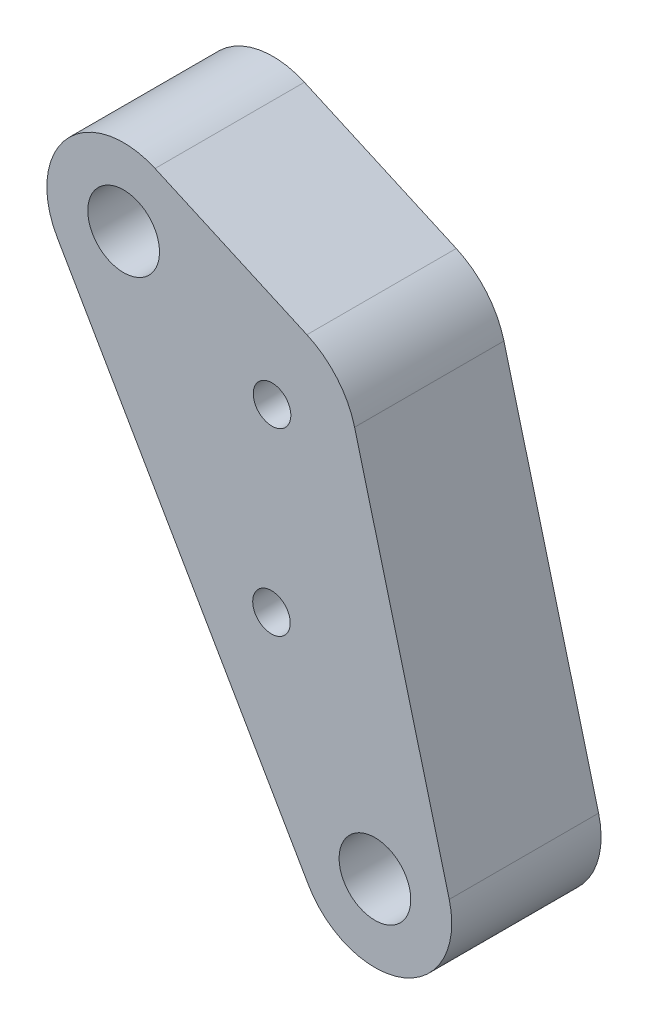
ISO-10303-21;
HEADER;
FILE_DESCRIPTION(('STEP AP214'),'2;1');
FILE_NAME('part.step','',(''),(''),'','','');
FILE_SCHEMA(('AUTOMOTIVE_DESIGN { 1 0 10303 214 1 1 1 1 }'));
ENDSEC;
DATA;
#1=APPLICATION_CONTEXT('core data for automotive mechanical design processes');
#2=APPLICATION_PROTOCOL_DEFINITION('international standard','automotive_design',2000,#1);
#3=PRODUCT_CONTEXT('',#1,'mechanical');
#4=PRODUCT('Part','Part','',(#3));
#5=PRODUCT_RELATED_PRODUCT_CATEGORY('part','',(#4));
#6=PRODUCT_DEFINITION_FORMATION('','',#4);
#7=PRODUCT_DEFINITION_CONTEXT('part definition',#1,'design');
#8=PRODUCT_DEFINITION('design','',#6,#7);
#9=PRODUCT_DEFINITION_SHAPE('','',#8);
#10=(LENGTH_UNIT() NAMED_UNIT(*) SI_UNIT(.MILLI.,.METRE.));
#11=(NAMED_UNIT(*) PLANE_ANGLE_UNIT() SI_UNIT($,.RADIAN.));
#12=(NAMED_UNIT(*) SI_UNIT($,.STERADIAN.) SOLID_ANGLE_UNIT());
#13=UNCERTAINTY_MEASURE_WITH_UNIT(LENGTH_MEASURE(1.E-05),#10,'distance_accuracy_value','');
#14=(GEOMETRIC_REPRESENTATION_CONTEXT(3) GLOBAL_UNCERTAINTY_ASSIGNED_CONTEXT((#13)) GLOBAL_UNIT_ASSIGNED_CONTEXT((#10,
#11,#12)) REPRESENTATION_CONTEXT('',''));
#15=CARTESIAN_POINT('',(0.,0.,0.));
#16=DIRECTION('',(0.,0.,1.));
#17=DIRECTION('',(1.,0.,0.));
#18=AXIS2_PLACEMENT_3D('',#15,#16,#17);
#19=CARTESIAN_POINT('',(0.,-34.,17.5));
#20=DIRECTION('',(0.,0.,1.));
#21=DIRECTION('',(1.,0.,0.));
#22=AXIS2_PLACEMENT_3D('',#19,#20,#21);
#23=PLANE('',#22);
#24=CARTESIAN_POINT('',(0.,-34.,17.5));
#25=DIRECTION('',(0.,0.,-1.));
#26=DIRECTION('',(-1.,0.,0.));
#27=AXIS2_PLACEMENT_3D('',#24,#25,#26);
#28=CIRCLE('',#27,4.20000000000001);
#29=CARTESIAN_POINT('',(-4.20000000000001,-34.,17.5));
#30=VERTEX_POINT('',#29);
#31=EDGE_CURVE('E338',#30,#30,#28,.T.);
#32=ORIENTED_EDGE('',*,*,#31,.T.);
#33=EDGE_LOOP('',(#32));
#34=FACE_BOUND('',#33,.T.);
#35=DIRECTION('',(-0.253215214139542,0.967409972725248,0.));
#36=VECTOR('',#35,1.);
#37=CARTESIAN_POINT('',(8.70668975452724,-31.7210630727441,17.5));
#38=LINE('',#37,#36);
#39=CARTESIAN_POINT('',(8.70668975452724,-31.7210630727441,17.5));
#40=VERTEX_POINT('',#39);
#41=CARTESIAN_POINT('',(-2.38326862762132,10.6481775451841,17.5));
#42=VERTEX_POINT('',#41);
#43=EDGE_CURVE('E154',#40,#42,#38,.T.);
#44=ORIENTED_EDGE('',*,*,#43,.T.);
#45=CARTESIAN_POINT('',(-12.0573683548738,8.11602540378865,17.5));
#46=DIRECTION('',(0.,0.,1.));
#47=DIRECTION('',(1.,0.,0.));
#48=AXIS2_PLACEMENT_3D('',#45,#46,#47);
#49=CIRCLE('',#48,10.);
#50=CARTESIAN_POINT('',(-7.96949925973064,17.2423240106157,17.5));
#51=VERTEX_POINT('',#50);
#52=EDGE_CURVE('E52',#42,#51,#49,.T.);
#53=ORIENTED_EDGE('',*,*,#52,.T.);
#54=DIRECTION('',(-0.912629860682705,0.408786909514317,0.));
#55=VECTOR('',#54,1.);
#56=CARTESIAN_POINT('',(-3.59656756097926,15.2835920956721,17.5));
#57=LINE('',#56,#55);
#58=CARTESIAN_POINT('',(-25.7657815430421,25.2136687461443,17.5));
#59=VERTEX_POINT('',#58);
#60=EDGE_CURVE('E156',#51,#59,#57,.T.);
#61=ORIENTED_EDGE('',*,*,#60,.T.);
#62=CARTESIAN_POINT('',(-29.4448637286709,17.,17.5));
#63=DIRECTION('',(0.,0.,1.));
#64=DIRECTION('',(1.,0.,0.));
#65=AXIS2_PLACEMENT_3D('',#62,#63,#64);
#66=CIRCLE('',#65,9.);
#67=CARTESIAN_POINT('',(-37.2390923627309,12.5,17.5));
#68=VERTEX_POINT('',#67);
#69=EDGE_CURVE('E158',#59,#68,#66,.T.);
#70=ORIENTED_EDGE('',*,*,#69,.T.);
#71=DIRECTION('',(0.500000000000001,-0.866025403784438,0.));
#72=VECTOR('',#71,1.);
#73=CARTESIAN_POINT('',(-37.2390923627309,12.5,17.5));
#74=LINE('',#73,#72);
#75=CARTESIAN_POINT('',(-7.79422863405994,-38.5,17.5));
#76=VERTEX_POINT('',#75);
#77=EDGE_CURVE('E140',#68,#76,#74,.T.);
#78=ORIENTED_EDGE('',*,*,#77,.T.);
#79=CARTESIAN_POINT('',(0.,-34.,17.5));
#80=DIRECTION('',(0.,0.,1.));
#81=DIRECTION('',(1.,0.,0.));
#82=AXIS2_PLACEMENT_3D('',#79,#80,#81);
#83=CIRCLE('',#82,9.);
#84=EDGE_CURVE('E134',#76,#40,#83,.T.);
#85=ORIENTED_EDGE('',*,*,#84,.T.);
#86=EDGE_LOOP('',(#44,#53,#61,#70,#78,#85));
#87=FACE_BOUND('',#86,.T.);
#88=CARTESIAN_POINT('',(-12.0573683548738,8.11602540378868,17.5));
#89=DIRECTION('',(0.,0.,-1.));
#90=DIRECTION('',(-1.,0.,0.));
#91=AXIS2_PLACEMENT_3D('',#88,#89,#90);
#92=CIRCLE('',#91,2.20000000000001);
#93=CARTESIAN_POINT('',(-14.2573683548738,8.11602540378868,17.5));
#94=VERTEX_POINT('',#93);
#95=EDGE_CURVE('E126',#94,#94,#92,.T.);
#96=ORIENTED_EDGE('',*,*,#95,.T.);
#97=EDGE_LOOP('',(#96));
#98=FACE_BOUND('',#97,.T.);
#99=CARTESIAN_POINT('',(-12.1243556529851,-12.999999999995,17.5));
#100=DIRECTION('',(0.,0.,-1.));
#101=DIRECTION('',(-1.,0.,0.));
#102=AXIS2_PLACEMENT_3D('',#99,#100,#101);
#103=CIRCLE('',#102,2.20000000000001);
#104=CARTESIAN_POINT('',(-14.3243556529851,-12.999999999995,17.5));
#105=VERTEX_POINT('',#104);
#106=EDGE_CURVE('E353',#105,#105,#103,.T.);
#107=ORIENTED_EDGE('',*,*,#106,.T.);
#108=EDGE_LOOP('',(#107));
#109=FACE_BOUND('',#108,.T.);
#110=CARTESIAN_POINT('',(-29.4448637286709,17.,17.5));
#111=DIRECTION('',(0.,0.,-1.));
#112=DIRECTION('',(-1.,0.,0.));
#113=AXIS2_PLACEMENT_3D('',#110,#111,#112);
#114=CIRCLE('',#113,4.20000000000001);
#115=CARTESIAN_POINT('',(-33.644863728671,17.,17.5));
#116=VERTEX_POINT('',#115);
#117=EDGE_CURVE('E342',#116,#116,#114,.T.);
#118=ORIENTED_EDGE('',*,*,#117,.T.);
#119=EDGE_LOOP('',(#118));
#120=FACE_BOUND('',#119,.T.);
#121=ADVANCED_FACE('F30',(#34,#87,#98,#109,#120),#23,.T.);
#122=CARTESIAN_POINT('',(0.,-34.,0.));
#123=DIRECTION('',(0.,0.,1.));
#124=DIRECTION('',(1.,0.,0.));
#125=AXIS2_PLACEMENT_3D('',#122,#123,#124);
#126=PLANE('',#125);
#127=CARTESIAN_POINT('',(0.,-34.,0.));
#128=DIRECTION('',(0.,0.,-1.));
#129=DIRECTION('',(-1.,0.,0.));
#130=AXIS2_PLACEMENT_3D('',#127,#128,#129);
#131=CIRCLE('',#130,4.20000000000001);
#132=CARTESIAN_POINT('',(-4.20000000000001,-34.,0.));
#133=VERTEX_POINT('',#132);
#134=EDGE_CURVE('E341',#133,#133,#131,.T.);
#135=ORIENTED_EDGE('',*,*,#134,.F.);
#136=EDGE_LOOP('',(#135));
#137=FACE_BOUND('',#136,.T.);
#138=CARTESIAN_POINT('',(-12.1243556529851,-12.999999999995,0.));
#139=DIRECTION('',(0.,0.,-1.));
#140=DIRECTION('',(-1.,0.,0.));
#141=AXIS2_PLACEMENT_3D('',#138,#139,#140);
#142=CIRCLE('',#141,2.20000000000001);
#143=CARTESIAN_POINT('',(-14.3243556529851,-12.999999999995,0.));
#144=VERTEX_POINT('',#143);
#145=EDGE_CURVE('E344',#144,#144,#142,.T.);
#146=ORIENTED_EDGE('',*,*,#145,.F.);
#147=EDGE_LOOP('',(#146));
#148=FACE_BOUND('',#147,.T.);
#149=CARTESIAN_POINT('',(-12.0573683548738,8.11602540378868,0.));
#150=DIRECTION('',(0.,0.,-1.));
#151=DIRECTION('',(-1.,0.,0.));
#152=AXIS2_PLACEMENT_3D('',#149,#150,#151);
#153=CIRCLE('',#152,2.20000000000001);
#154=CARTESIAN_POINT('',(-14.2573683548738,8.11602540378868,0.));
#155=VERTEX_POINT('',#154);
#156=EDGE_CURVE('E355',#155,#155,#153,.T.);
#157=ORIENTED_EDGE('',*,*,#156,.F.);
#158=EDGE_LOOP('',(#157));
#159=FACE_BOUND('',#158,.T.);
#160=DIRECTION('',(-0.912629860682705,0.408786909514317,0.));
#161=VECTOR('',#160,1.);
#162=CARTESIAN_POINT('',(-3.59656756097926,15.2835920956721,0.));
#163=LINE('',#162,#161);
#164=CARTESIAN_POINT('',(-7.96949925973064,17.2423240106157,0.));
#165=VERTEX_POINT('',#164);
#166=CARTESIAN_POINT('',(-25.7657815430421,25.2136687461443,0.));
#167=VERTEX_POINT('',#166);
#168=EDGE_CURVE('E143',#165,#167,#163,.T.);
#169=ORIENTED_EDGE('',*,*,#168,.F.);
#170=CARTESIAN_POINT('',(-12.0573683548738,8.11602540378865,0.));
#171=DIRECTION('',(0.,0.,1.));
#172=DIRECTION('',(1.,0.,0.));
#173=AXIS2_PLACEMENT_3D('',#170,#171,#172);
#174=CIRCLE('',#173,10.);
#175=CARTESIAN_POINT('',(-2.38326862762132,10.6481775451841,0.));
#176=VERTEX_POINT('',#175);
#177=EDGE_CURVE('E11',#165,#176,#174,.F.);
#178=ORIENTED_EDGE('',*,*,#177,.T.);
#179=DIRECTION('',(-0.253215214139542,0.967409972725248,0.));
#180=VECTOR('',#179,1.);
#181=CARTESIAN_POINT('',(8.70668975452724,-31.7210630727441,0.));
#182=LINE('',#181,#180);
#183=CARTESIAN_POINT('',(8.70668975452724,-31.7210630727441,0.));
#184=VERTEX_POINT('',#183);
#185=EDGE_CURVE('E139',#184,#176,#182,.T.);
#186=ORIENTED_EDGE('',*,*,#185,.F.);
#187=CARTESIAN_POINT('',(0.,-34.,0.));
#188=DIRECTION('',(0.,0.,1.));
#189=DIRECTION('',(1.,0.,0.));
#190=AXIS2_PLACEMENT_3D('',#187,#188,#189);
#191=CIRCLE('',#190,9.);
#192=CARTESIAN_POINT('',(-7.79422863405994,-38.5,0.));
#193=VERTEX_POINT('',#192);
#194=EDGE_CURVE('E136',#193,#184,#191,.T.);
#195=ORIENTED_EDGE('',*,*,#194,.F.);
#196=DIRECTION('',(0.500000000000001,-0.866025403784438,0.));
#197=VECTOR('',#196,1.);
#198=CARTESIAN_POINT('',(-37.2390923627309,12.5,0.));
#199=LINE('',#198,#197);
#200=CARTESIAN_POINT('',(-37.2390923627309,12.5,0.));
#201=VERTEX_POINT('',#200);
#202=EDGE_CURVE('E148',#201,#193,#199,.T.);
#203=ORIENTED_EDGE('',*,*,#202,.F.);
#204=CARTESIAN_POINT('',(-29.4448637286709,17.,0.));
#205=DIRECTION('',(0.,0.,1.));
#206=DIRECTION('',(1.,0.,0.));
#207=AXIS2_PLACEMENT_3D('',#204,#205,#206);
#208=CIRCLE('',#207,9.);
#209=EDGE_CURVE('E145',#167,#201,#208,.T.);
#210=ORIENTED_EDGE('',*,*,#209,.F.);
#211=EDGE_LOOP('',(#169,#178,#186,#195,#203,#210));
#212=FACE_BOUND('',#211,.T.);
#213=CARTESIAN_POINT('',(-29.4448637286709,17.,0.));
#214=DIRECTION('',(0.,0.,-1.));
#215=DIRECTION('',(-1.,0.,0.));
#216=AXIS2_PLACEMENT_3D('',#213,#214,#215);
#217=CIRCLE('',#216,4.20000000000001);
#218=CARTESIAN_POINT('',(-33.644863728671,17.,0.));
#219=VERTEX_POINT('',#218);
#220=EDGE_CURVE('E347',#219,#219,#217,.T.);
#221=ORIENTED_EDGE('',*,*,#220,.F.);
#222=EDGE_LOOP('',(#221));
#223=FACE_BOUND('',#222,.T.);
#224=ADVANCED_FACE('F188',(#137,#148,#159,#212,#223),#126,.F.);
#225=CARTESIAN_POINT('',(0.,-34.,0.));
#226=DIRECTION('',(0.,0.,1.));
#227=DIRECTION('',(1.,0.,0.));
#228=AXIS2_PLACEMENT_3D('',#225,#226,#227);
#229=CYLINDRICAL_SURFACE('',#228,9.);
#230=ORIENTED_EDGE('',*,*,#84,.F.);
#231=DIRECTION('',(0.,0.,1.));
#232=VECTOR('',#231,1.);
#233=CARTESIAN_POINT('',(-7.79422863405994,-38.5,0.));
#234=LINE('',#233,#232);
#235=EDGE_CURVE('E163',#193,#76,#234,.T.);
#236=ORIENTED_EDGE('',*,*,#235,.F.);
#237=ORIENTED_EDGE('',*,*,#194,.T.);
#238=DIRECTION('',(0.,0.,1.));
#239=VECTOR('',#238,1.);
#240=CARTESIAN_POINT('',(8.70668975452724,-31.7210630727441,0.));
#241=LINE('',#240,#239);
#242=EDGE_CURVE('E151',#184,#40,#241,.T.);
#243=ORIENTED_EDGE('',*,*,#242,.T.);
#244=EDGE_LOOP('',(#230,#236,#237,#243));
#245=FACE_BOUND('',#244,.T.);
#246=ADVANCED_FACE('F185',(#245),#229,.T.);
#247=CARTESIAN_POINT('',(-37.2390923627309,12.5,0.));
#248=DIRECTION('',(-0.866025403784438,-0.500000000000001,0.));
#249=DIRECTION('',(0.500000000000001,-0.866025403784438,0.));
#250=AXIS2_PLACEMENT_3D('',#247,#248,#249);
#251=PLANE('',#250);
#252=CARTESIAN_POINT('',(-32.2390923627309,3.83974596215558,8.75));
#253=DIRECTION('',(-0.866025403784438,-0.500000000000001,0.));
#254=DIRECTION('',(0.500000000000001,-0.866025403784438,0.));
#255=AXIS2_PLACEMENT_3D('',#252,#253,#254);
#256=CIRCLE('',#255,1.5);
#257=CARTESIAN_POINT('',(-32.7785972129849,4.77419577372533,9.7919875556885));
#258=VERTEX_POINT('',#257);
#259=CARTESIAN_POINT('',(-31.6995875124769,2.90529615058585,9.79198755568849));
#260=VERTEX_POINT('',#259);
#261=EDGE_CURVE('E106',#258,#260,#256,.T.);
#262=ORIENTED_EDGE('',*,*,#261,.F.);
#263=DIRECTION('',(-0.347329185229498,0.601591795768998,-0.719339800338648));
#264=VECTOR('',#263,1.);
#265=CARTESIAN_POINT('',(-32.2390923627309,3.83974596215557,10.9093348094386));
#266=LINE('',#265,#264);
#267=CARTESIAN_POINT('',(-32.2390923627309,3.83974596215557,10.9093348094386));
#268=VERTEX_POINT('',#267);
#269=EDGE_CURVE('E120',#268,#258,#266,.T.);
#270=ORIENTED_EDGE('',*,*,#269,.F.);
#271=DIRECTION('',(-0.347329185229501,0.601591795768987,0.719339800338655));
#272=VECTOR('',#271,1.);
#273=CARTESIAN_POINT('',(-31.6995875124769,2.90529615058584,9.79198755568849));
#274=LINE('',#273,#272);
#275=EDGE_CURVE('E123',#260,#268,#274,.T.);
#276=ORIENTED_EDGE('',*,*,#275,.F.);
#277=EDGE_LOOP('',(#262,#270,#276));
#278=FACE_BOUND('',#277,.T.);
#279=ORIENTED_EDGE('',*,*,#77,.F.);
#280=DIRECTION('',(0.,0.,1.));
#281=VECTOR('',#280,1.);
#282=CARTESIAN_POINT('',(-37.2390923627309,12.5,0.));
#283=LINE('',#282,#281);
#284=EDGE_CURVE('E166',#201,#68,#283,.T.);
#285=ORIENTED_EDGE('',*,*,#284,.F.);
#286=ORIENTED_EDGE('',*,*,#202,.T.);
#287=ORIENTED_EDGE('',*,*,#235,.T.);
#288=EDGE_LOOP('',(#279,#285,#286,#287));
#289=FACE_BOUND('',#288,.T.);
#290=ADVANCED_FACE('F211',(#278,#289),#251,.T.);
#291=CARTESIAN_POINT('',(-29.4448637286709,17.,0.));
#292=DIRECTION('',(0.,0.,1.));
#293=DIRECTION('',(1.,0.,0.));
#294=AXIS2_PLACEMENT_3D('',#291,#292,#293);
#295=CYLINDRICAL_SURFACE('',#294,9.);
#296=ORIENTED_EDGE('',*,*,#69,.F.);
#297=DIRECTION('',(0.,0.,1.));
#298=VECTOR('',#297,1.);
#299=CARTESIAN_POINT('',(-25.7657815430421,25.2136687461443,0.));
#300=LINE('',#299,#298);
#301=EDGE_CURVE('E168',#167,#59,#300,.T.);
#302=ORIENTED_EDGE('',*,*,#301,.F.);
#303=ORIENTED_EDGE('',*,*,#209,.T.);
#304=ORIENTED_EDGE('',*,*,#284,.T.);
#305=EDGE_LOOP('',(#296,#302,#303,#304));
#306=FACE_BOUND('',#305,.T.);
#307=ADVANCED_FACE('F214',(#306),#295,.T.);
#308=CARTESIAN_POINT('',(-3.59656756097926,15.2835920956721,0.));
#309=DIRECTION('',(0.408786909514317,0.912629860682705,0.));
#310=DIRECTION('',(-0.912629860682705,0.408786909514317,0.));
#311=AXIS2_PLACEMENT_3D('',#308,#309,#310);
#312=PLANE('',#311);
#313=ORIENTED_EDGE('',*,*,#60,.F.);
#314=DIRECTION('',(0.,0.,1.));
#315=VECTOR('',#314,1.);
#316=CARTESIAN_POINT('',(-7.96949925973064,17.2423240106157,0.));
#317=LINE('',#316,#315);
#318=EDGE_CURVE('E38',#51,#165,#317,.F.);
#319=ORIENTED_EDGE('',*,*,#318,.T.);
#320=ORIENTED_EDGE('',*,*,#168,.T.);
#321=ORIENTED_EDGE('',*,*,#301,.T.);
#322=EDGE_LOOP('',(#313,#319,#320,#321));
#323=FACE_BOUND('',#322,.T.);
#324=ADVANCED_FACE('F218',(#323),#312,.T.);
#325=CARTESIAN_POINT('',(8.70668975452724,-31.7210630727441,0.));
#326=DIRECTION('',(0.967409972725248,0.253215214139542,0.));
#327=DIRECTION('',(-0.253215214139542,0.967409972725248,0.));
#328=AXIS2_PLACEMENT_3D('',#325,#326,#327);
#329=PLANE('',#328);
#330=ORIENTED_EDGE('',*,*,#185,.T.);
#331=DIRECTION('',(0.,0.,1.));
#332=VECTOR('',#331,1.);
#333=CARTESIAN_POINT('',(-2.38326862762132,10.6481775451841,0.));
#334=LINE('',#333,#332);
#335=EDGE_CURVE('E165',#176,#42,#334,.T.);
#336=ORIENTED_EDGE('',*,*,#335,.T.);
#337=ORIENTED_EDGE('',*,*,#43,.F.);
#338=ORIENTED_EDGE('',*,*,#242,.F.);
#339=EDGE_LOOP('',(#330,#336,#337,#338));
#340=FACE_BOUND('',#339,.T.);
#341=ADVANCED_FACE('F177',(#340),#329,.T.);
#342=CARTESIAN_POINT('',(-31.3730669589465,4.33974596215558,8.75));
#343=DIRECTION('',(-0.866025403784438,-0.500000000000001,0.));
#344=DIRECTION('',(0.500000000000001,-0.866025403784438,0.));
#345=AXIS2_PLACEMENT_3D('',#342,#343,#344);
#346=CYLINDRICAL_SURFACE('',#345,1.5);
#347=ORIENTED_EDGE('',*,*,#261,.T.);
#348=DIRECTION('',(-0.866025403784438,-0.500000000000001,0.));
#349=VECTOR('',#348,1.);
#350=CARTESIAN_POINT('',(-30.8335621086925,3.40529615058584,9.79198755568849));
#351=LINE('',#350,#349);
#352=CARTESIAN_POINT('',(-30.8335621086925,3.40529615058584,9.79198755568849));
#353=VERTEX_POINT('',#352);
#354=EDGE_CURVE('E99',#353,#260,#351,.T.);
#355=ORIENTED_EDGE('',*,*,#354,.F.);
#356=CARTESIAN_POINT('',(-31.3730669589465,4.33974596215558,8.75));
#357=DIRECTION('',(-0.866025403784438,-0.500000000000001,0.));
#358=DIRECTION('',(0.500000000000001,-0.866025403784438,0.));
#359=AXIS2_PLACEMENT_3D('',#356,#357,#358);
#360=CIRCLE('',#359,1.5);
#361=CARTESIAN_POINT('',(-31.9125718092005,5.27419577372532,9.7919875556885));
#362=VERTEX_POINT('',#361);
#363=EDGE_CURVE('E103',#362,#353,#360,.T.);
#364=ORIENTED_EDGE('',*,*,#363,.F.);
#365=DIRECTION('',(-0.866025403784438,-0.500000000000001,0.));
#366=VECTOR('',#365,1.);
#367=CARTESIAN_POINT('',(-31.9125718092005,5.27419577372532,9.7919875556885));
#368=LINE('',#367,#366);
#369=EDGE_CURVE('E132',#362,#258,#368,.T.);
#370=ORIENTED_EDGE('',*,*,#369,.T.);
#371=EDGE_LOOP('',(#347,#355,#364,#370));
#372=FACE_BOUND('',#371,.T.);
#373=ADVANCED_FACE('F101',(#372),#346,.F.);
#374=CARTESIAN_POINT('',(-31.3730669589465,4.33974596215557,10.9093348094386));
#375=DIRECTION('',(-0.359669900169325,0.622966541046495,0.694658370459001));
#376=DIRECTION('',(0.,-0.744479207661407,0.667645646552005));
#377=AXIS2_PLACEMENT_3D('',#374,#375,#376);
#378=PLANE('',#377);
#379=ORIENTED_EDGE('',*,*,#269,.T.);
#380=ORIENTED_EDGE('',*,*,#369,.F.);
#381=DIRECTION('',(-0.347329185229498,0.601591795768998,-0.719339800338648));
#382=VECTOR('',#381,1.);
#383=CARTESIAN_POINT('',(-31.3730669589465,4.33974596215557,10.9093348094386));
#384=LINE('',#383,#382);
#385=CARTESIAN_POINT('',(-31.3730669589465,4.33974596215557,10.9093348094386));
#386=VERTEX_POINT('',#385);
#387=EDGE_CURVE('E111',#386,#362,#384,.T.);
#388=ORIENTED_EDGE('',*,*,#387,.F.);
#389=DIRECTION('',(-0.866025403784438,-0.500000000000001,0.));
#390=VECTOR('',#389,1.);
#391=CARTESIAN_POINT('',(-31.3730669589465,4.33974596215557,10.9093348094386));
#392=LINE('',#391,#390);
#393=EDGE_CURVE('E110',#386,#268,#392,.T.);
#394=ORIENTED_EDGE('',*,*,#393,.T.);
#395=EDGE_LOOP('',(#379,#380,#388,#394));
#396=FACE_BOUND('',#395,.T.);
#397=ADVANCED_FACE('F250',(#396),#378,.F.);
#398=CARTESIAN_POINT('',(-30.8335621086925,3.40529615058584,9.79198755568849));
#399=DIRECTION('',(0.359669900169328,-0.622966541046501,0.694658370458993));
#400=DIRECTION('',(0.,-0.7444792076614,-0.667645646552012));
#401=AXIS2_PLACEMENT_3D('',#398,#399,#400);
#402=PLANE('',#401);
#403=ORIENTED_EDGE('',*,*,#275,.T.);
#404=ORIENTED_EDGE('',*,*,#393,.F.);
#405=DIRECTION('',(-0.347329185229501,0.601591795768987,0.719339800338655));
#406=VECTOR('',#405,1.);
#407=CARTESIAN_POINT('',(-30.8335621086925,3.40529615058584,9.79198755568849));
#408=LINE('',#407,#406);
#409=EDGE_CURVE('E114',#353,#386,#408,.T.);
#410=ORIENTED_EDGE('',*,*,#409,.F.);
#411=ORIENTED_EDGE('',*,*,#354,.T.);
#412=EDGE_LOOP('',(#403,#404,#410,#411));
#413=FACE_BOUND('',#412,.T.);
#414=ADVANCED_FACE('F115',(#413),#402,.F.);
#415=CARTESIAN_POINT('',(-31.3730669589465,4.33974596215558,8.75));
#416=DIRECTION('',(-0.866025403784438,-0.500000000000001,0.));
#417=DIRECTION('',(0.500000000000001,-0.866025403784438,0.));
#418=AXIS2_PLACEMENT_3D('',#415,#416,#417);
#419=PLANE('',#418);
#420=ORIENTED_EDGE('',*,*,#363,.T.);
#421=ORIENTED_EDGE('',*,*,#409,.T.);
#422=ORIENTED_EDGE('',*,*,#387,.T.);
#423=EDGE_LOOP('',(#420,#421,#422));
#424=FACE_BOUND('',#423,.T.);
#425=ADVANCED_FACE('F119',(#424),#419,.T.);
#426=CARTESIAN_POINT('',(-12.0573683548738,8.11602540378868,0.));
#427=DIRECTION('',(0.,0.,-1.));
#428=DIRECTION('',(-1.,0.,0.));
#429=AXIS2_PLACEMENT_3D('',#426,#427,#428);
#430=CYLINDRICAL_SURFACE('',#429,2.20000000000001);
#431=ORIENTED_EDGE('',*,*,#95,.F.);
#432=EDGE_LOOP('',(#431));
#433=FACE_BOUND('',#432,.T.);
#434=ORIENTED_EDGE('',*,*,#156,.T.);
#435=EDGE_LOOP('',(#434));
#436=FACE_BOUND('',#435,.T.);
#437=ADVANCED_FACE('F269',(#433,#436),#430,.F.);
#438=CARTESIAN_POINT('',(-12.1243556529851,-12.999999999995,0.));
#439=DIRECTION('',(0.,0.,-1.));
#440=DIRECTION('',(-1.,0.,0.));
#441=AXIS2_PLACEMENT_3D('',#438,#439,#440);
#442=CYLINDRICAL_SURFACE('',#441,2.20000000000001);
#443=ORIENTED_EDGE('',*,*,#106,.F.);
#444=EDGE_LOOP('',(#443));
#445=FACE_BOUND('',#444,.T.);
#446=ORIENTED_EDGE('',*,*,#145,.T.);
#447=EDGE_LOOP('',(#446));
#448=FACE_BOUND('',#447,.T.);
#449=ADVANCED_FACE('F276',(#445,#448),#442,.F.);
#450=CARTESIAN_POINT('',(0.,-34.,0.));
#451=DIRECTION('',(0.,0.,-1.));
#452=DIRECTION('',(-1.,0.,0.));
#453=AXIS2_PLACEMENT_3D('',#450,#451,#452);
#454=CYLINDRICAL_SURFACE('',#453,4.20000000000001);
#455=ORIENTED_EDGE('',*,*,#31,.F.);
#456=EDGE_LOOP('',(#455));
#457=FACE_BOUND('',#456,.T.);
#458=ORIENTED_EDGE('',*,*,#134,.T.);
#459=EDGE_LOOP('',(#458));
#460=FACE_BOUND('',#459,.T.);
#461=ADVANCED_FACE('F197',(#457,#460),#454,.F.);
#462=CARTESIAN_POINT('',(-29.4448637286709,17.,0.));
#463=DIRECTION('',(0.,0.,-1.));
#464=DIRECTION('',(-1.,0.,0.));
#465=AXIS2_PLACEMENT_3D('',#462,#463,#464);
#466=CYLINDRICAL_SURFACE('',#465,4.20000000000001);
#467=ORIENTED_EDGE('',*,*,#117,.F.);
#468=EDGE_LOOP('',(#467));
#469=FACE_BOUND('',#468,.T.);
#470=ORIENTED_EDGE('',*,*,#220,.T.);
#471=EDGE_LOOP('',(#470));
#472=FACE_BOUND('',#471,.T.);
#473=ADVANCED_FACE('F193',(#469,#472),#466,.F.);
#474=CARTESIAN_POINT('',(-12.0573683548738,8.11602540378865,0.));
#475=DIRECTION('',(0.,0.,1.));
#476=DIRECTION('',(1.,0.,0.));
#477=AXIS2_PLACEMENT_3D('',#474,#475,#476);
#478=CYLINDRICAL_SURFACE('',#477,10.);
#479=ORIENTED_EDGE('',*,*,#177,.F.);
#480=ORIENTED_EDGE('',*,*,#318,.F.);
#481=ORIENTED_EDGE('',*,*,#52,.F.);
#482=ORIENTED_EDGE('',*,*,#335,.F.);
#483=EDGE_LOOP('',(#479,#480,#481,#482));
#484=FACE_BOUND('',#483,.T.);
#485=ADVANCED_FACE('F32',(#484),#478,.T.);
#486=CLOSED_SHELL('',(#121,#224,#246,#290,#307,#324,#341,#373,#397,#414,#425,#437,#449,#461,
#473,#485));
#487=MANIFOLD_SOLID_BREP('B2',#486);
#488=ADVANCED_BREP_SHAPE_REPRESENTATION('',(#18,#487),#14);
#489=SHAPE_DEFINITION_REPRESENTATION(#9,#488);
ENDSEC;
END-ISO-10303-21;
